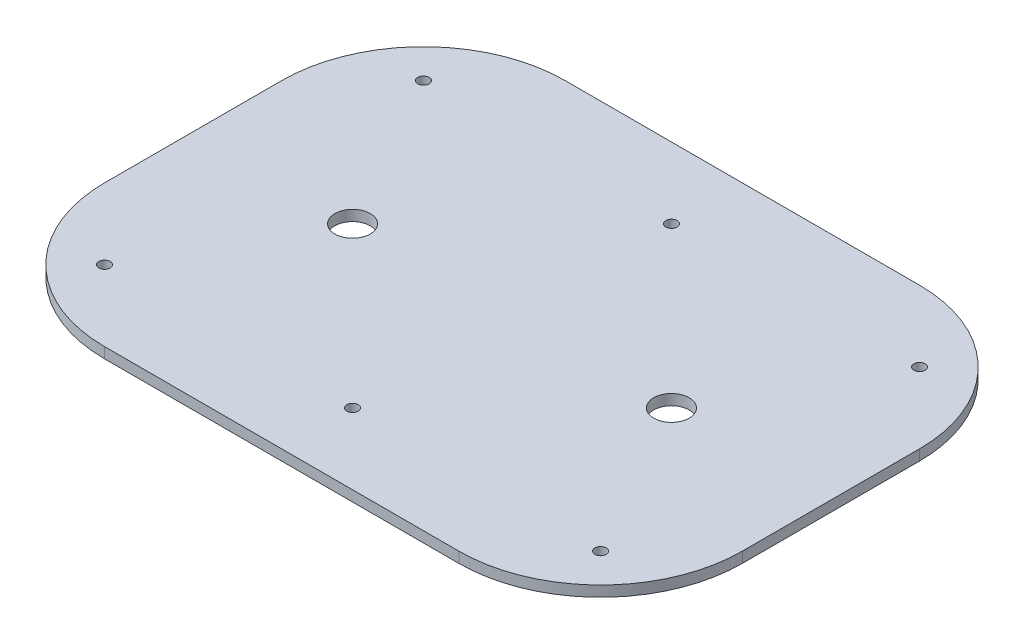
ISO-10303-21;
HEADER;
FILE_DESCRIPTION(('STEP AP214'),'2;1');
FILE_NAME('part.step','',(''),(''),'','','');
FILE_SCHEMA(('AUTOMOTIVE_DESIGN { 1 0 10303 214 1 1 1 1 }'));
ENDSEC;
DATA;
#1=APPLICATION_CONTEXT('core data for automotive mechanical design processes');
#2=APPLICATION_PROTOCOL_DEFINITION('international standard','automotive_design',2000,#1);
#3=PRODUCT_CONTEXT('',#1,'mechanical');
#4=PRODUCT('Part','Part','',(#3));
#5=PRODUCT_RELATED_PRODUCT_CATEGORY('part','',(#4));
#6=PRODUCT_DEFINITION_FORMATION('','',#4);
#7=PRODUCT_DEFINITION_CONTEXT('part definition',#1,'design');
#8=PRODUCT_DEFINITION('design','',#6,#7);
#9=PRODUCT_DEFINITION_SHAPE('','',#8);
#10=(LENGTH_UNIT() NAMED_UNIT(*) SI_UNIT(.MILLI.,.METRE.));
#11=(NAMED_UNIT(*) PLANE_ANGLE_UNIT() SI_UNIT($,.RADIAN.));
#12=(NAMED_UNIT(*) SI_UNIT($,.STERADIAN.) SOLID_ANGLE_UNIT());
#13=UNCERTAINTY_MEASURE_WITH_UNIT(LENGTH_MEASURE(1.E-05),#10,'distance_accuracy_value','');
#14=(GEOMETRIC_REPRESENTATION_CONTEXT(3) GLOBAL_UNCERTAINTY_ASSIGNED_CONTEXT((#13)) GLOBAL_UNIT_ASSIGNED_CONTEXT((#10,
#11,#12)) REPRESENTATION_CONTEXT('',''));
#15=CARTESIAN_POINT('',(0.,0.,0.));
#16=DIRECTION('',(0.,0.,1.));
#17=DIRECTION('',(1.,0.,0.));
#18=AXIS2_PLACEMENT_3D('',#15,#16,#17);
#19=CARTESIAN_POINT('',(90.,3.,-65.));
#20=DIRECTION('',(-1.,0.,0.));
#21=DIRECTION('',(0.,0.,1.));
#22=AXIS2_PLACEMENT_3D('',#19,#20,#21);
#23=PLANE('',#22);
#24=DIRECTION('',(0.,0.,-1.));
#25=VECTOR('',#24,1.);
#26=CARTESIAN_POINT('',(90.,0.,-65.));
#27=LINE('',#26,#25);
#28=CARTESIAN_POINT('',(90.,0.,25.));
#29=VERTEX_POINT('',#28);
#30=CARTESIAN_POINT('',(90.,0.,-25.));
#31=VERTEX_POINT('',#30);
#32=EDGE_CURVE('E197',#29,#31,#27,.T.);
#33=ORIENTED_EDGE('',*,*,#32,.T.);
#34=DIRECTION('',(0.,-1.,0.));
#35=VECTOR('',#34,1.);
#36=CARTESIAN_POINT('',(90.,3.,-25.));
#37=LINE('',#36,#35);
#38=CARTESIAN_POINT('',(90.,3.,-25.));
#39=VERTEX_POINT('',#38);
#40=EDGE_CURVE('E66',#31,#39,#37,.F.);
#41=ORIENTED_EDGE('',*,*,#40,.T.);
#42=DIRECTION('',(0.,0.,-1.));
#43=VECTOR('',#42,1.);
#44=CARTESIAN_POINT('',(90.,3.,-65.));
#45=LINE('',#44,#43);
#46=CARTESIAN_POINT('',(90.,3.,25.));
#47=VERTEX_POINT('',#46);
#48=EDGE_CURVE('E136',#47,#39,#45,.T.);
#49=ORIENTED_EDGE('',*,*,#48,.F.);
#50=DIRECTION('',(0.,-1.,0.));
#51=VECTOR('',#50,1.);
#52=CARTESIAN_POINT('',(90.,3.,25.));
#53=LINE('',#52,#51);
#54=EDGE_CURVE('E174',#47,#29,#53,.T.);
#55=ORIENTED_EDGE('',*,*,#54,.T.);
#56=EDGE_LOOP('',(#33,#41,#49,#55));
#57=FACE_BOUND('',#56,.T.);
#58=ADVANCED_FACE('F44',(#57),#23,.F.);
#59=CARTESIAN_POINT('',(-90.,3.,-65.));
#60=DIRECTION('',(0.,0.,1.));
#61=DIRECTION('',(1.,0.,0.));
#62=AXIS2_PLACEMENT_3D('',#59,#60,#61);
#63=PLANE('',#62);
#64=DIRECTION('',(-1.,0.,0.));
#65=VECTOR('',#64,1.);
#66=CARTESIAN_POINT('',(-90.,3.,-65.));
#67=LINE('',#66,#65);
#68=CARTESIAN_POINT('',(49.9999999999999,3.,-65.));
#69=VERTEX_POINT('',#68);
#70=CARTESIAN_POINT('',(-50.,3.,-65.));
#71=VERTEX_POINT('',#70);
#72=EDGE_CURVE('E141',#69,#71,#67,.T.);
#73=ORIENTED_EDGE('',*,*,#72,.F.);
#74=DIRECTION('',(0.,-1.,0.));
#75=VECTOR('',#74,1.);
#76=CARTESIAN_POINT('',(50.,3.,-65.));
#77=LINE('',#76,#75);
#78=CARTESIAN_POINT('',(49.9999999999999,0.,-65.));
#79=VERTEX_POINT('',#78);
#80=EDGE_CURVE('E165',#69,#79,#77,.T.);
#81=ORIENTED_EDGE('',*,*,#80,.T.);
#82=DIRECTION('',(-1.,0.,0.));
#83=VECTOR('',#82,1.);
#84=CARTESIAN_POINT('',(-90.,0.,-65.));
#85=LINE('',#84,#83);
#86=CARTESIAN_POINT('',(-50.,0.,-65.));
#87=VERTEX_POINT('',#86);
#88=EDGE_CURVE('E143',#79,#87,#85,.T.);
#89=ORIENTED_EDGE('',*,*,#88,.T.);
#90=DIRECTION('',(0.,-1.,0.));
#91=VECTOR('',#90,1.);
#92=CARTESIAN_POINT('',(-50.,3.,-65.));
#93=LINE('',#92,#91);
#94=EDGE_CURVE('E161',#87,#71,#93,.F.);
#95=ORIENTED_EDGE('',*,*,#94,.T.);
#96=EDGE_LOOP('',(#73,#81,#89,#95));
#97=FACE_BOUND('',#96,.T.);
#98=ADVANCED_FACE('F190',(#97),#63,.F.);
#99=CARTESIAN_POINT('',(-90.,3.,-65.));
#100=DIRECTION('',(1.,0.,0.));
#101=DIRECTION('',(0.,0.,-1.));
#102=AXIS2_PLACEMENT_3D('',#99,#100,#101);
#103=PLANE('',#102);
#104=DIRECTION('',(0.,0.,1.));
#105=VECTOR('',#104,1.);
#106=CARTESIAN_POINT('',(-90.,0.,-65.));
#107=LINE('',#106,#105);
#108=CARTESIAN_POINT('',(-90.,0.,-25.));
#109=VERTEX_POINT('',#108);
#110=CARTESIAN_POINT('',(-90.,0.,25.));
#111=VERTEX_POINT('',#110);
#112=EDGE_CURVE('E137',#109,#111,#107,.T.);
#113=ORIENTED_EDGE('',*,*,#112,.T.);
#114=DIRECTION('',(0.,-1.,0.));
#115=VECTOR('',#114,1.);
#116=CARTESIAN_POINT('',(-90.,3.,25.));
#117=LINE('',#116,#115);
#118=CARTESIAN_POINT('',(-90.,3.,25.));
#119=VERTEX_POINT('',#118);
#120=EDGE_CURVE('E117',#111,#119,#117,.F.);
#121=ORIENTED_EDGE('',*,*,#120,.T.);
#122=DIRECTION('',(0.,0.,1.));
#123=VECTOR('',#122,1.);
#124=CARTESIAN_POINT('',(-90.,3.,-65.));
#125=LINE('',#124,#123);
#126=CARTESIAN_POINT('',(-90.,3.,-25.));
#127=VERTEX_POINT('',#126);
#128=EDGE_CURVE('E194',#127,#119,#125,.T.);
#129=ORIENTED_EDGE('',*,*,#128,.F.);
#130=DIRECTION('',(0.,-1.,0.));
#131=VECTOR('',#130,1.);
#132=CARTESIAN_POINT('',(-90.,3.,-25.));
#133=LINE('',#132,#131);
#134=EDGE_CURVE('E123',#127,#109,#133,.T.);
#135=ORIENTED_EDGE('',*,*,#134,.T.);
#136=EDGE_LOOP('',(#113,#121,#129,#135));
#137=FACE_BOUND('',#136,.T.);
#138=ADVANCED_FACE('F312',(#137),#103,.F.);
#139=CARTESIAN_POINT('',(-90.,3.,65.));
#140=DIRECTION('',(0.,0.,-1.));
#141=DIRECTION('',(-1.,0.,0.));
#142=AXIS2_PLACEMENT_3D('',#139,#140,#141);
#143=PLANE('',#142);
#144=DIRECTION('',(1.,0.,0.));
#145=VECTOR('',#144,1.);
#146=CARTESIAN_POINT('',(-90.,0.,65.));
#147=LINE('',#146,#145);
#148=CARTESIAN_POINT('',(-50.,0.,65.));
#149=VERTEX_POINT('',#148);
#150=CARTESIAN_POINT('',(50.,0.,65.));
#151=VERTEX_POINT('',#150);
#152=EDGE_CURVE('E127',#149,#151,#147,.T.);
#153=ORIENTED_EDGE('',*,*,#152,.T.);
#154=DIRECTION('',(0.,-1.,0.));
#155=VECTOR('',#154,1.);
#156=CARTESIAN_POINT('',(50.,3.,65.));
#157=LINE('',#156,#155);
#158=CARTESIAN_POINT('',(50.,3.,65.));
#159=VERTEX_POINT('',#158);
#160=EDGE_CURVE('E11',#151,#159,#157,.F.);
#161=ORIENTED_EDGE('',*,*,#160,.T.);
#162=DIRECTION('',(1.,0.,0.));
#163=VECTOR('',#162,1.);
#164=CARTESIAN_POINT('',(-90.,3.,65.));
#165=LINE('',#164,#163);
#166=CARTESIAN_POINT('',(-50.,3.,65.));
#167=VERTEX_POINT('',#166);
#168=EDGE_CURVE('E128',#167,#159,#165,.T.);
#169=ORIENTED_EDGE('',*,*,#168,.F.);
#170=DIRECTION('',(0.,-1.,0.));
#171=VECTOR('',#170,1.);
#172=CARTESIAN_POINT('',(-50.,3.,65.));
#173=LINE('',#172,#171);
#174=EDGE_CURVE('E116',#167,#149,#173,.T.);
#175=ORIENTED_EDGE('',*,*,#174,.T.);
#176=EDGE_LOOP('',(#153,#161,#169,#175));
#177=FACE_BOUND('',#176,.T.);
#178=ADVANCED_FACE('F126',(#177),#143,.F.);
#179=CARTESIAN_POINT('',(0.,3.,0.));
#180=DIRECTION('',(0.,1.,0.));
#181=DIRECTION('',(0.,0.,1.));
#182=AXIS2_PLACEMENT_3D('',#179,#180,#181);
#183=PLANE('',#182);
#184=CARTESIAN_POINT('',(-70.,3.,-45.));
#185=DIRECTION('',(0.,1.,0.));
#186=DIRECTION('',(0.,0.,1.));
#187=AXIS2_PLACEMENT_3D('',#184,#185,#186);
#188=CIRCLE('',#187,1.6);
#189=CARTESIAN_POINT('',(-70.,3.,-43.4));
#190=VERTEX_POINT('',#189);
#191=EDGE_CURVE('E268',#190,#190,#188,.T.);
#192=ORIENTED_EDGE('',*,*,#191,.F.);
#193=EDGE_LOOP('',(#192));
#194=FACE_BOUND('',#193,.T.);
#195=CARTESIAN_POINT('',(0.,3.,-45.));
#196=DIRECTION('',(0.,1.,0.));
#197=DIRECTION('',(0.,0.,1.));
#198=AXIS2_PLACEMENT_3D('',#195,#196,#197);
#199=CIRCLE('',#198,1.6);
#200=CARTESIAN_POINT('',(0.,3.,-43.4));
#201=VERTEX_POINT('',#200);
#202=EDGE_CURVE('E260',#201,#201,#199,.T.);
#203=ORIENTED_EDGE('',*,*,#202,.F.);
#204=EDGE_LOOP('',(#203));
#205=FACE_BOUND('',#204,.T.);
#206=CARTESIAN_POINT('',(70.,3.,-45.));
#207=DIRECTION('',(0.,1.,0.));
#208=DIRECTION('',(0.,0.,1.));
#209=AXIS2_PLACEMENT_3D('',#206,#207,#208);
#210=CIRCLE('',#209,1.6);
#211=CARTESIAN_POINT('',(70.,3.,-43.4));
#212=VERTEX_POINT('',#211);
#213=EDGE_CURVE('E252',#212,#212,#210,.T.);
#214=ORIENTED_EDGE('',*,*,#213,.F.);
#215=EDGE_LOOP('',(#214));
#216=FACE_BOUND('',#215,.T.);
#217=CARTESIAN_POINT('',(-70.,3.,45.));
#218=DIRECTION('',(0.,1.,0.));
#219=DIRECTION('',(0.,0.,1.));
#220=AXIS2_PLACEMENT_3D('',#217,#218,#219);
#221=CIRCLE('',#220,1.6);
#222=CARTESIAN_POINT('',(-70.,3.,46.6));
#223=VERTEX_POINT('',#222);
#224=EDGE_CURVE('E244',#223,#223,#221,.T.);
#225=ORIENTED_EDGE('',*,*,#224,.F.);
#226=EDGE_LOOP('',(#225));
#227=FACE_BOUND('',#226,.T.);
#228=CARTESIAN_POINT('',(0.,3.,45.));
#229=DIRECTION('',(0.,1.,0.));
#230=DIRECTION('',(0.,0.,1.));
#231=AXIS2_PLACEMENT_3D('',#228,#229,#230);
#232=CIRCLE('',#231,1.6);
#233=CARTESIAN_POINT('',(0.,3.,46.6));
#234=VERTEX_POINT('',#233);
#235=EDGE_CURVE('E236',#234,#234,#232,.T.);
#236=ORIENTED_EDGE('',*,*,#235,.F.);
#237=EDGE_LOOP('',(#236));
#238=FACE_BOUND('',#237,.T.);
#239=CARTESIAN_POINT('',(70.,3.,45.));
#240=DIRECTION('',(0.,1.,0.));
#241=DIRECTION('',(0.,0.,1.));
#242=AXIS2_PLACEMENT_3D('',#239,#240,#241);
#243=CIRCLE('',#242,1.6);
#244=CARTESIAN_POINT('',(70.,3.,46.6));
#245=VERTEX_POINT('',#244);
#246=EDGE_CURVE('E228',#245,#245,#243,.T.);
#247=ORIENTED_EDGE('',*,*,#246,.F.);
#248=EDGE_LOOP('',(#247));
#249=FACE_BOUND('',#248,.T.);
#250=CARTESIAN_POINT('',(-45.,3.,0.));
#251=DIRECTION('',(0.,1.,0.));
#252=DIRECTION('',(0.,0.,1.));
#253=AXIS2_PLACEMENT_3D('',#250,#251,#252);
#254=CIRCLE('',#253,5.);
#255=CARTESIAN_POINT('',(-45.,3.,5.));
#256=VERTEX_POINT('',#255);
#257=EDGE_CURVE('E220',#256,#256,#254,.T.);
#258=ORIENTED_EDGE('',*,*,#257,.F.);
#259=EDGE_LOOP('',(#258));
#260=FACE_BOUND('',#259,.T.);
#261=CARTESIAN_POINT('',(45.,3.,0.));
#262=DIRECTION('',(0.,1.,0.));
#263=DIRECTION('',(0.,0.,1.));
#264=AXIS2_PLACEMENT_3D('',#261,#262,#263);
#265=CIRCLE('',#264,5.);
#266=CARTESIAN_POINT('',(45.,3.,5.));
#267=VERTEX_POINT('',#266);
#268=EDGE_CURVE('E205',#267,#267,#265,.T.);
#269=ORIENTED_EDGE('',*,*,#268,.F.);
#270=EDGE_LOOP('',(#269));
#271=FACE_BOUND('',#270,.T.);
#272=ORIENTED_EDGE('',*,*,#48,.T.);
#273=CARTESIAN_POINT('',(50.,3.,-25.));
#274=DIRECTION('',(0.,1.,0.));
#275=DIRECTION('',(0.,0.,1.));
#276=AXIS2_PLACEMENT_3D('',#273,#274,#275);
#277=CIRCLE('',#276,40.);
#278=EDGE_CURVE('E53',#39,#69,#277,.T.);
#279=ORIENTED_EDGE('',*,*,#278,.T.);
#280=ORIENTED_EDGE('',*,*,#72,.T.);
#281=CARTESIAN_POINT('',(-50.,3.,-25.));
#282=DIRECTION('',(0.,1.,0.));
#283=DIRECTION('',(0.,0.,1.));
#284=AXIS2_PLACEMENT_3D('',#281,#282,#283);
#285=CIRCLE('',#284,40.);
#286=EDGE_CURVE('E155',#71,#127,#285,.T.);
#287=ORIENTED_EDGE('',*,*,#286,.T.);
#288=ORIENTED_EDGE('',*,*,#128,.T.);
#289=CARTESIAN_POINT('',(-50.,3.,25.));
#290=DIRECTION('',(0.,1.,0.));
#291=DIRECTION('',(0.,0.,1.));
#292=AXIS2_PLACEMENT_3D('',#289,#290,#291);
#293=CIRCLE('',#292,40.);
#294=EDGE_CURVE('E158',#119,#167,#293,.T.);
#295=ORIENTED_EDGE('',*,*,#294,.T.);
#296=ORIENTED_EDGE('',*,*,#168,.T.);
#297=CARTESIAN_POINT('',(50.,3.,25.));
#298=DIRECTION('',(0.,1.,0.));
#299=DIRECTION('',(0.,0.,1.));
#300=AXIS2_PLACEMENT_3D('',#297,#298,#299);
#301=CIRCLE('',#300,40.);
#302=EDGE_CURVE('E180',#159,#47,#301,.T.);
#303=ORIENTED_EDGE('',*,*,#302,.T.);
#304=EDGE_LOOP('',(#272,#279,#280,#287,#288,#295,#296,#303));
#305=FACE_BOUND('',#304,.T.);
#306=ADVANCED_FACE('F186',(#194,#205,#216,#227,#238,#249,#260,#271,#305),#183,.T.);
#307=CARTESIAN_POINT('',(0.,0.,0.));
#308=DIRECTION('',(0.,1.,0.));
#309=DIRECTION('',(0.,0.,1.));
#310=AXIS2_PLACEMENT_3D('',#307,#308,#309);
#311=PLANE('',#310);
#312=CARTESIAN_POINT('',(-70.,0.,-45.));
#313=DIRECTION('',(0.,1.,0.));
#314=DIRECTION('',(0.,0.,1.));
#315=AXIS2_PLACEMENT_3D('',#312,#313,#314);
#316=CIRCLE('',#315,1.6);
#317=CARTESIAN_POINT('',(-70.,0.,-43.4));
#318=VERTEX_POINT('',#317);
#319=EDGE_CURVE('E264',#318,#318,#316,.T.);
#320=ORIENTED_EDGE('',*,*,#319,.T.);
#321=EDGE_LOOP('',(#320));
#322=FACE_BOUND('',#321,.T.);
#323=CARTESIAN_POINT('',(0.,0.,-45.));
#324=DIRECTION('',(0.,1.,0.));
#325=DIRECTION('',(0.,0.,1.));
#326=AXIS2_PLACEMENT_3D('',#323,#324,#325);
#327=CIRCLE('',#326,1.6);
#328=CARTESIAN_POINT('',(0.,0.,-43.4));
#329=VERTEX_POINT('',#328);
#330=EDGE_CURVE('E256',#329,#329,#327,.T.);
#331=ORIENTED_EDGE('',*,*,#330,.T.);
#332=EDGE_LOOP('',(#331));
#333=FACE_BOUND('',#332,.T.);
#334=CARTESIAN_POINT('',(70.,0.,-45.));
#335=DIRECTION('',(0.,1.,0.));
#336=DIRECTION('',(0.,0.,1.));
#337=AXIS2_PLACEMENT_3D('',#334,#335,#336);
#338=CIRCLE('',#337,1.6);
#339=CARTESIAN_POINT('',(70.,0.,-43.4));
#340=VERTEX_POINT('',#339);
#341=EDGE_CURVE('E248',#340,#340,#338,.T.);
#342=ORIENTED_EDGE('',*,*,#341,.T.);
#343=EDGE_LOOP('',(#342));
#344=FACE_BOUND('',#343,.T.);
#345=CARTESIAN_POINT('',(-70.,0.,45.));
#346=DIRECTION('',(0.,1.,0.));
#347=DIRECTION('',(0.,0.,1.));
#348=AXIS2_PLACEMENT_3D('',#345,#346,#347);
#349=CIRCLE('',#348,1.6);
#350=CARTESIAN_POINT('',(-70.,0.,46.6));
#351=VERTEX_POINT('',#350);
#352=EDGE_CURVE('E240',#351,#351,#349,.T.);
#353=ORIENTED_EDGE('',*,*,#352,.T.);
#354=EDGE_LOOP('',(#353));
#355=FACE_BOUND('',#354,.T.);
#356=CARTESIAN_POINT('',(0.,0.,45.));
#357=DIRECTION('',(0.,1.,0.));
#358=DIRECTION('',(0.,0.,1.));
#359=AXIS2_PLACEMENT_3D('',#356,#357,#358);
#360=CIRCLE('',#359,1.6);
#361=CARTESIAN_POINT('',(0.,0.,46.6));
#362=VERTEX_POINT('',#361);
#363=EDGE_CURVE('E232',#362,#362,#360,.T.);
#364=ORIENTED_EDGE('',*,*,#363,.T.);
#365=EDGE_LOOP('',(#364));
#366=FACE_BOUND('',#365,.T.);
#367=CARTESIAN_POINT('',(70.,0.,45.));
#368=DIRECTION('',(0.,1.,0.));
#369=DIRECTION('',(0.,0.,1.));
#370=AXIS2_PLACEMENT_3D('',#367,#368,#369);
#371=CIRCLE('',#370,1.6);
#372=CARTESIAN_POINT('',(70.,0.,46.6));
#373=VERTEX_POINT('',#372);
#374=EDGE_CURVE('E224',#373,#373,#371,.T.);
#375=ORIENTED_EDGE('',*,*,#374,.T.);
#376=EDGE_LOOP('',(#375));
#377=FACE_BOUND('',#376,.T.);
#378=CARTESIAN_POINT('',(-45.,0.,0.));
#379=DIRECTION('',(0.,1.,0.));
#380=DIRECTION('',(0.,0.,1.));
#381=AXIS2_PLACEMENT_3D('',#378,#379,#380);
#382=CIRCLE('',#381,5.);
#383=CARTESIAN_POINT('',(-45.,0.,5.));
#384=VERTEX_POINT('',#383);
#385=EDGE_CURVE('E216',#384,#384,#382,.T.);
#386=ORIENTED_EDGE('',*,*,#385,.T.);
#387=EDGE_LOOP('',(#386));
#388=FACE_BOUND('',#387,.T.);
#389=CARTESIAN_POINT('',(45.,0.,0.));
#390=DIRECTION('',(0.,1.,0.));
#391=DIRECTION('',(0.,0.,1.));
#392=AXIS2_PLACEMENT_3D('',#389,#390,#391);
#393=CIRCLE('',#392,5.);
#394=CARTESIAN_POINT('',(45.,0.,5.));
#395=VERTEX_POINT('',#394);
#396=EDGE_CURVE('E200',#395,#395,#393,.T.);
#397=ORIENTED_EDGE('',*,*,#396,.T.);
#398=EDGE_LOOP('',(#397));
#399=FACE_BOUND('',#398,.T.);
#400=ORIENTED_EDGE('',*,*,#88,.F.);
#401=CARTESIAN_POINT('',(50.,0.,-25.));
#402=DIRECTION('',(0.,1.,0.));
#403=DIRECTION('',(0.,0.,1.));
#404=AXIS2_PLACEMENT_3D('',#401,#402,#403);
#405=CIRCLE('',#404,40.);
#406=EDGE_CURVE('E171',#79,#31,#405,.F.);
#407=ORIENTED_EDGE('',*,*,#406,.T.);
#408=ORIENTED_EDGE('',*,*,#32,.F.);
#409=CARTESIAN_POINT('',(50.,0.,25.));
#410=DIRECTION('',(0.,1.,0.));
#411=DIRECTION('',(0.,0.,1.));
#412=AXIS2_PLACEMENT_3D('',#409,#410,#411);
#413=CIRCLE('',#412,40.);
#414=EDGE_CURVE('E134',#29,#151,#413,.F.);
#415=ORIENTED_EDGE('',*,*,#414,.T.);
#416=ORIENTED_EDGE('',*,*,#152,.F.);
#417=CARTESIAN_POINT('',(-50.,0.,25.));
#418=DIRECTION('',(0.,1.,0.));
#419=DIRECTION('',(0.,0.,1.));
#420=AXIS2_PLACEMENT_3D('',#417,#418,#419);
#421=CIRCLE('',#420,40.);
#422=EDGE_CURVE('E112',#149,#111,#421,.F.);
#423=ORIENTED_EDGE('',*,*,#422,.T.);
#424=ORIENTED_EDGE('',*,*,#112,.F.);
#425=CARTESIAN_POINT('',(-50.,0.,-25.));
#426=DIRECTION('',(0.,1.,0.));
#427=DIRECTION('',(0.,0.,1.));
#428=AXIS2_PLACEMENT_3D('',#425,#426,#427);
#429=CIRCLE('',#428,40.);
#430=EDGE_CURVE('E124',#109,#87,#429,.F.);
#431=ORIENTED_EDGE('',*,*,#430,.T.);
#432=EDGE_LOOP('',(#400,#407,#408,#415,#416,#423,#424,#431));
#433=FACE_BOUND('',#432,.T.);
#434=ADVANCED_FACE('F132',(#322,#333,#344,#355,#366,#377,#388,#399,#433),#311,.F.);
#435=CARTESIAN_POINT('',(-50.,3.,25.));
#436=DIRECTION('',(0.,-1.,0.));
#437=DIRECTION('',(0.,0.,-1.));
#438=AXIS2_PLACEMENT_3D('',#435,#436,#437);
#439=CYLINDRICAL_SURFACE('',#438,40.);
#440=ORIENTED_EDGE('',*,*,#294,.F.);
#441=ORIENTED_EDGE('',*,*,#120,.F.);
#442=ORIENTED_EDGE('',*,*,#422,.F.);
#443=ORIENTED_EDGE('',*,*,#174,.F.);
#444=EDGE_LOOP('',(#440,#441,#442,#443));
#445=FACE_BOUND('',#444,.T.);
#446=ADVANCED_FACE('F115',(#445),#439,.T.);
#447=CARTESIAN_POINT('',(-50.,3.,-25.));
#448=DIRECTION('',(0.,-1.,0.));
#449=DIRECTION('',(0.,0.,-1.));
#450=AXIS2_PLACEMENT_3D('',#447,#448,#449);
#451=CYLINDRICAL_SURFACE('',#450,40.);
#452=ORIENTED_EDGE('',*,*,#286,.F.);
#453=ORIENTED_EDGE('',*,*,#94,.F.);
#454=ORIENTED_EDGE('',*,*,#430,.F.);
#455=ORIENTED_EDGE('',*,*,#134,.F.);
#456=EDGE_LOOP('',(#452,#453,#454,#455));
#457=FACE_BOUND('',#456,.T.);
#458=ADVANCED_FACE('F318',(#457),#451,.T.);
#459=CARTESIAN_POINT('',(50.,3.,-25.));
#460=DIRECTION('',(0.,-1.,0.));
#461=DIRECTION('',(0.,0.,-1.));
#462=AXIS2_PLACEMENT_3D('',#459,#460,#461);
#463=CYLINDRICAL_SURFACE('',#462,40.);
#464=ORIENTED_EDGE('',*,*,#278,.F.);
#465=ORIENTED_EDGE('',*,*,#40,.F.);
#466=ORIENTED_EDGE('',*,*,#406,.F.);
#467=ORIENTED_EDGE('',*,*,#80,.F.);
#468=EDGE_LOOP('',(#464,#465,#466,#467));
#469=FACE_BOUND('',#468,.T.);
#470=ADVANCED_FACE('F196',(#469),#463,.T.);
#471=CARTESIAN_POINT('',(50.,3.,25.));
#472=DIRECTION('',(0.,-1.,0.));
#473=DIRECTION('',(0.,0.,-1.));
#474=AXIS2_PLACEMENT_3D('',#471,#472,#473);
#475=CYLINDRICAL_SURFACE('',#474,40.);
#476=ORIENTED_EDGE('',*,*,#302,.F.);
#477=ORIENTED_EDGE('',*,*,#160,.F.);
#478=ORIENTED_EDGE('',*,*,#414,.F.);
#479=ORIENTED_EDGE('',*,*,#54,.F.);
#480=EDGE_LOOP('',(#476,#477,#478,#479));
#481=FACE_BOUND('',#480,.T.);
#482=ADVANCED_FACE('F46',(#481),#475,.T.);
#483=CARTESIAN_POINT('',(45.,3.,0.));
#484=DIRECTION('',(0.,1.,0.));
#485=DIRECTION('',(0.,0.,1.));
#486=AXIS2_PLACEMENT_3D('',#483,#484,#485);
#487=CYLINDRICAL_SURFACE('',#486,5.);
#488=ORIENTED_EDGE('',*,*,#396,.F.);
#489=EDGE_LOOP('',(#488));
#490=FACE_BOUND('',#489,.T.);
#491=ORIENTED_EDGE('',*,*,#268,.T.);
#492=EDGE_LOOP('',(#491));
#493=FACE_BOUND('',#492,.T.);
#494=ADVANCED_FACE('F292',(#490,#493),#487,.F.);
#495=CARTESIAN_POINT('',(-45.,3.,0.));
#496=DIRECTION('',(0.,1.,0.));
#497=DIRECTION('',(0.,0.,1.));
#498=AXIS2_PLACEMENT_3D('',#495,#496,#497);
#499=CYLINDRICAL_SURFACE('',#498,5.);
#500=ORIENTED_EDGE('',*,*,#385,.F.);
#501=EDGE_LOOP('',(#500));
#502=FACE_BOUND('',#501,.T.);
#503=ORIENTED_EDGE('',*,*,#257,.T.);
#504=EDGE_LOOP('',(#503));
#505=FACE_BOUND('',#504,.T.);
#506=ADVANCED_FACE('F294',(#502,#505),#499,.F.);
#507=CARTESIAN_POINT('',(70.,3.,45.));
#508=DIRECTION('',(0.,1.,0.));
#509=DIRECTION('',(0.,0.,1.));
#510=AXIS2_PLACEMENT_3D('',#507,#508,#509);
#511=CYLINDRICAL_SURFACE('',#510,1.6);
#512=ORIENTED_EDGE('',*,*,#374,.F.);
#513=EDGE_LOOP('',(#512));
#514=FACE_BOUND('',#513,.T.);
#515=ORIENTED_EDGE('',*,*,#246,.T.);
#516=EDGE_LOOP('',(#515));
#517=FACE_BOUND('',#516,.T.);
#518=ADVANCED_FACE('F301',(#514,#517),#511,.F.);
#519=CARTESIAN_POINT('',(0.,3.,45.));
#520=DIRECTION('',(0.,1.,0.));
#521=DIRECTION('',(0.,0.,1.));
#522=AXIS2_PLACEMENT_3D('',#519,#520,#521);
#523=CYLINDRICAL_SURFACE('',#522,1.6);
#524=ORIENTED_EDGE('',*,*,#363,.F.);
#525=EDGE_LOOP('',(#524));
#526=FACE_BOUND('',#525,.T.);
#527=ORIENTED_EDGE('',*,*,#235,.T.);
#528=EDGE_LOOP('',(#527));
#529=FACE_BOUND('',#528,.T.);
#530=ADVANCED_FACE('F352',(#526,#529),#523,.F.);
#531=CARTESIAN_POINT('',(-70.,3.,45.));
#532=DIRECTION('',(0.,1.,0.));
#533=DIRECTION('',(0.,0.,1.));
#534=AXIS2_PLACEMENT_3D('',#531,#532,#533);
#535=CYLINDRICAL_SURFACE('',#534,1.6);
#536=ORIENTED_EDGE('',*,*,#352,.F.);
#537=EDGE_LOOP('',(#536));
#538=FACE_BOUND('',#537,.T.);
#539=ORIENTED_EDGE('',*,*,#224,.T.);
#540=EDGE_LOOP('',(#539));
#541=FACE_BOUND('',#540,.T.);
#542=ADVANCED_FACE('F363',(#538,#541),#535,.F.);
#543=CARTESIAN_POINT('',(70.,3.,-45.));
#544=DIRECTION('',(0.,1.,0.));
#545=DIRECTION('',(0.,0.,1.));
#546=AXIS2_PLACEMENT_3D('',#543,#544,#545);
#547=CYLINDRICAL_SURFACE('',#546,1.6);
#548=ORIENTED_EDGE('',*,*,#341,.F.);
#549=EDGE_LOOP('',(#548));
#550=FACE_BOUND('',#549,.T.);
#551=ORIENTED_EDGE('',*,*,#213,.T.);
#552=EDGE_LOOP('',(#551));
#553=FACE_BOUND('',#552,.T.);
#554=ADVANCED_FACE('F373',(#550,#553),#547,.F.);
#555=CARTESIAN_POINT('',(0.,3.,-45.));
#556=DIRECTION('',(0.,1.,0.));
#557=DIRECTION('',(0.,0.,1.));
#558=AXIS2_PLACEMENT_3D('',#555,#556,#557);
#559=CYLINDRICAL_SURFACE('',#558,1.6);
#560=ORIENTED_EDGE('',*,*,#330,.F.);
#561=EDGE_LOOP('',(#560));
#562=FACE_BOUND('',#561,.T.);
#563=ORIENTED_EDGE('',*,*,#202,.T.);
#564=EDGE_LOOP('',(#563));
#565=FACE_BOUND('',#564,.T.);
#566=ADVANCED_FACE('F383',(#562,#565),#559,.F.);
#567=CARTESIAN_POINT('',(-70.,3.,-45.));
#568=DIRECTION('',(0.,1.,0.));
#569=DIRECTION('',(0.,0.,1.));
#570=AXIS2_PLACEMENT_3D('',#567,#568,#569);
#571=CYLINDRICAL_SURFACE('',#570,1.6);
#572=ORIENTED_EDGE('',*,*,#319,.F.);
#573=EDGE_LOOP('',(#572));
#574=FACE_BOUND('',#573,.T.);
#575=ORIENTED_EDGE('',*,*,#191,.T.);
#576=EDGE_LOOP('',(#575));
#577=FACE_BOUND('',#576,.T.);
#578=ADVANCED_FACE('F273',(#574,#577),#571,.F.);
#579=CLOSED_SHELL('',(#58,#98,#138,#178,#306,#434,#446,#458,#470,#482,#494,#506,#518,#530,#542,
#554,#566,#578));
#580=MANIFOLD_SOLID_BREP('B2',#579);
#581=ADVANCED_BREP_SHAPE_REPRESENTATION('',(#18,#580),#14);
#582=SHAPE_DEFINITION_REPRESENTATION(#9,#581);
ENDSEC;
END-ISO-10303-21;
